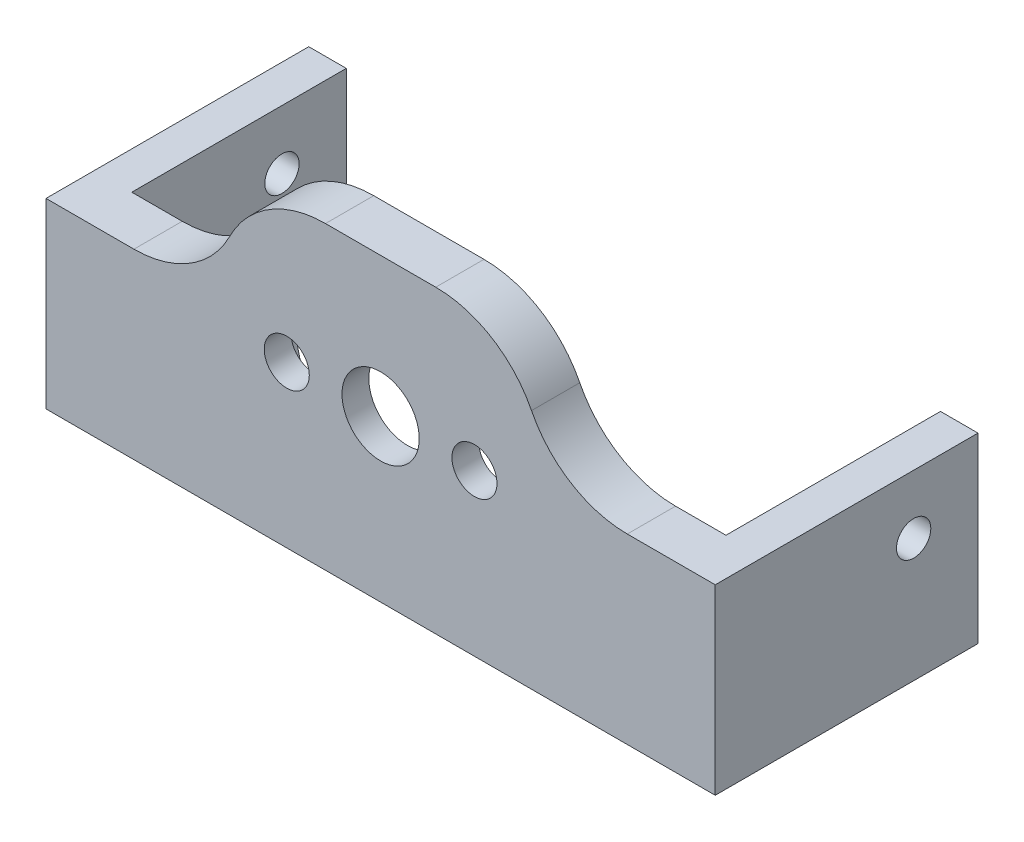
ISO-10303-21;
HEADER;
FILE_DESCRIPTION(('STEP AP214'),'2;1');
FILE_NAME('part.step','',(''),(''),'','','');
FILE_SCHEMA(('AUTOMOTIVE_DESIGN { 1 0 10303 214 1 1 1 1 }'));
ENDSEC;
DATA;
#1=APPLICATION_CONTEXT('core data for automotive mechanical design processes');
#2=APPLICATION_PROTOCOL_DEFINITION('international standard','automotive_design',2000,#1);
#3=PRODUCT_CONTEXT('',#1,'mechanical');
#4=PRODUCT('Part','Part','',(#3));
#5=PRODUCT_RELATED_PRODUCT_CATEGORY('part','',(#4));
#6=PRODUCT_DEFINITION_FORMATION('','',#4);
#7=PRODUCT_DEFINITION_CONTEXT('part definition',#1,'design');
#8=PRODUCT_DEFINITION('design','',#6,#7);
#9=PRODUCT_DEFINITION_SHAPE('','',#8);
#10=(LENGTH_UNIT() NAMED_UNIT(*) SI_UNIT(.MILLI.,.METRE.));
#11=(NAMED_UNIT(*) PLANE_ANGLE_UNIT() SI_UNIT($,.RADIAN.));
#12=(NAMED_UNIT(*) SI_UNIT($,.STERADIAN.) SOLID_ANGLE_UNIT());
#13=UNCERTAINTY_MEASURE_WITH_UNIT(LENGTH_MEASURE(1.E-05),#10,'distance_accuracy_value','');
#14=(GEOMETRIC_REPRESENTATION_CONTEXT(3) GLOBAL_UNCERTAINTY_ASSIGNED_CONTEXT((#13)) GLOBAL_UNIT_ASSIGNED_CONTEXT((#10,
#11,#12)) REPRESENTATION_CONTEXT('',''));
#15=CARTESIAN_POINT('',(0.,0.,0.));
#16=DIRECTION('',(0.,0.,1.));
#17=DIRECTION('',(1.,0.,0.));
#18=AXIS2_PLACEMENT_3D('',#15,#16,#17);
#19=CARTESIAN_POINT('',(0.,0.,0.));
#20=DIRECTION('',(0.,0.,1.));
#21=DIRECTION('',(1.,0.,0.));
#22=AXIS2_PLACEMENT_3D('',#19,#20,#21);
#23=PLANE('',#22);
#24=CARTESIAN_POINT('',(5.87133479212253,0.142231947483589,0.));
#25=DIRECTION('',(0.,0.,-1.));
#26=DIRECTION('',(-1.,0.,0.));
#27=AXIS2_PLACEMENT_3D('',#24,#25,#26);
#28=CIRCLE('',#27,12.55);
#29=CARTESIAN_POINT('',(-6.67866520787747,0.142231947483589,0.));
#30=VERTEX_POINT('',#29);
#31=EDGE_CURVE('E209',#30,#30,#28,.T.);
#32=ORIENTED_EDGE('',*,*,#31,.F.);
#33=EDGE_LOOP('',(#32));
#34=FACE_BOUND('',#33,.T.);
#35=CARTESIAN_POINT('',(-17.1286652078775,12.1422319474836,0.));
#36=DIRECTION('',(0.,0.,1.));
#37=DIRECTION('',(1.,0.,0.));
#38=AXIS2_PLACEMENT_3D('',#35,#36,#37);
#39=CIRCLE('',#38,10.);
#40=CARTESIAN_POINT('',(-17.1286652078775,2.14223194748359,0.));
#41=VERTEX_POINT('',#40);
#42=CARTESIAN_POINT('',(-8.19837965813159,7.64223194748359,0.));
#43=VERTEX_POINT('',#42);
#44=EDGE_CURVE('E259',#41,#43,#39,.T.);
#45=ORIENTED_EDGE('',*,*,#44,.T.);
#46=CARTESIAN_POINT('',(0.731905891614284,3.14223194748359,0.));
#47=DIRECTION('',(0.,0.,1.));
#48=DIRECTION('',(1.,0.,0.));
#49=AXIS2_PLACEMENT_3D('',#46,#47,#48);
#50=CIRCLE('',#49,10.);
#51=CARTESIAN_POINT('',(0.731905891614279,13.1422319474836,0.));
#52=VERTEX_POINT('',#51);
#53=EDGE_CURVE('E272',#43,#52,#50,.F.);
#54=ORIENTED_EDGE('',*,*,#53,.T.);
#55=DIRECTION('',(-1.,0.,0.));
#56=VECTOR('',#55,1.);
#57=CARTESIAN_POINT('',(-7.12866520787747,13.1422319474836,0.));
#58=LINE('',#57,#56);
#59=CARTESIAN_POINT('',(11.0107636926308,13.1422319474836,0.));
#60=VERTEX_POINT('',#59);
#61=EDGE_CURVE('E161',#60,#52,#58,.T.);
#62=ORIENTED_EDGE('',*,*,#61,.F.);
#63=CARTESIAN_POINT('',(11.0107636926308,3.14223194748359,0.));
#64=DIRECTION('',(0.,0.,1.));
#65=DIRECTION('',(1.,0.,0.));
#66=AXIS2_PLACEMENT_3D('',#63,#64,#65);
#67=CIRCLE('',#66,10.);
#68=CARTESIAN_POINT('',(19.9410492423767,7.64223194748359,0.));
#69=VERTEX_POINT('',#68);
#70=EDGE_CURVE('E270',#60,#69,#67,.F.);
#71=ORIENTED_EDGE('',*,*,#70,.T.);
#72=CARTESIAN_POINT('',(28.8713347921225,12.1422319474836,0.));
#73=DIRECTION('',(0.,0.,1.));
#74=DIRECTION('',(1.,0.,0.));
#75=AXIS2_PLACEMENT_3D('',#72,#73,#74);
#76=CIRCLE('',#75,10.);
#77=CARTESIAN_POINT('',(28.8713347921225,2.1422319474836,0.));
#78=VERTEX_POINT('',#77);
#79=EDGE_CURVE('E263',#69,#78,#76,.T.);
#80=ORIENTED_EDGE('',*,*,#79,.T.);
#81=DIRECTION('',(-1.,0.,0.));
#82=VECTOR('',#81,1.);
#83=CARTESIAN_POINT('',(18.8713347921225,2.14223194748359,0.));
#84=LINE('',#83,#82);
#85=CARTESIAN_POINT('',(33.5713347921225,2.1422319474836,0.));
#86=VERTEX_POINT('',#85);
#87=EDGE_CURVE('E227',#86,#78,#84,.T.);
#88=ORIENTED_EDGE('',*,*,#87,.F.);
#89=DIRECTION('',(0.,1.,0.));
#90=VECTOR('',#89,1.);
#91=CARTESIAN_POINT('',(33.5713347921225,2.1422319474836,0.));
#92=LINE('',#91,#90);
#93=CARTESIAN_POINT('',(33.5713347921225,-14.8577680525164,0.));
#94=VERTEX_POINT('',#93);
#95=EDGE_CURVE('E174',#94,#86,#92,.T.);
#96=ORIENTED_EDGE('',*,*,#95,.F.);
#97=DIRECTION('',(1.,0.,0.));
#98=VECTOR('',#97,1.);
#99=CARTESIAN_POINT('',(-25.3286652078775,-14.8577680525164,0.));
#100=LINE('',#99,#98);
#101=CARTESIAN_POINT('',(-21.8286652078775,-14.8577680525164,0.));
#102=VERTEX_POINT('',#101);
#103=EDGE_CURVE('E160',#102,#94,#100,.T.);
#104=ORIENTED_EDGE('',*,*,#103,.F.);
#105=DIRECTION('',(0.,-1.,0.));
#106=VECTOR('',#105,1.);
#107=CARTESIAN_POINT('',(-21.8286652078775,2.1422319474836,0.));
#108=LINE('',#107,#106);
#109=CARTESIAN_POINT('',(-21.8286652078775,2.1422319474836,0.));
#110=VERTEX_POINT('',#109);
#111=EDGE_CURVE('E167',#110,#102,#108,.T.);
#112=ORIENTED_EDGE('',*,*,#111,.F.);
#113=DIRECTION('',(-1.,0.,0.));
#114=VECTOR('',#113,1.);
#115=CARTESIAN_POINT('',(-7.12866520787747,2.14223194748359,0.));
#116=LINE('',#115,#114);
#117=EDGE_CURVE('E148',#41,#110,#116,.T.);
#118=ORIENTED_EDGE('',*,*,#117,.F.);
#119=EDGE_LOOP('',(#45,#54,#62,#71,#80,#88,#96,#104,#112,#118));
#120=FACE_BOUND('',#119,.T.);
#121=ADVANCED_FACE('F43',(#34,#120),#23,.F.);
#122=CARTESIAN_POINT('',(37.0713347921225,2.1422319474836,4.5));
#123=DIRECTION('',(-1.,0.,0.));
#124=DIRECTION('',(0.,0.,1.));
#125=AXIS2_PLACEMENT_3D('',#122,#123,#124);
#126=PLANE('',#125);
#127=CARTESIAN_POINT('',(37.0713347921225,-3.35776805251641,-14.));
#128=DIRECTION('',(1.,0.,0.));
#129=DIRECTION('',(0.,0.,-1.));
#130=AXIS2_PLACEMENT_3D('',#127,#128,#129);
#131=CIRCLE('',#130,1.6);
#132=CARTESIAN_POINT('',(37.0713347921225,-3.35776805251641,-15.6));
#133=VERTEX_POINT('',#132);
#134=EDGE_CURVE('E389',#133,#133,#131,.T.);
#135=ORIENTED_EDGE('',*,*,#134,.F.);
#136=EDGE_LOOP('',(#135));
#137=FACE_BOUND('',#136,.T.);
#138=DIRECTION('',(0.,0.,-1.));
#139=VECTOR('',#138,1.);
#140=CARTESIAN_POINT('',(37.0713347921225,-14.8577680525164,4.5));
#141=LINE('',#140,#139);
#142=CARTESIAN_POINT('',(37.0713347921225,-14.8577680525164,4.5));
#143=VERTEX_POINT('',#142);
#144=CARTESIAN_POINT('',(37.0713347921225,-14.8577680525164,-20.));
#145=VERTEX_POINT('',#144);
#146=EDGE_CURVE('E244',#143,#145,#141,.T.);
#147=ORIENTED_EDGE('',*,*,#146,.T.);
#148=DIRECTION('',(0.,-1.,0.));
#149=VECTOR('',#148,1.);
#150=CARTESIAN_POINT('',(37.0713347921225,2.1422319474836,-20.));
#151=LINE('',#150,#149);
#152=CARTESIAN_POINT('',(37.0713347921225,2.1422319474836,-20.));
#153=VERTEX_POINT('',#152);
#154=EDGE_CURVE('E178',#153,#145,#151,.T.);
#155=ORIENTED_EDGE('',*,*,#154,.F.);
#156=DIRECTION('',(0.,0.,-1.));
#157=VECTOR('',#156,1.);
#158=CARTESIAN_POINT('',(37.0713347921225,2.1422319474836,4.5));
#159=LINE('',#158,#157);
#160=CARTESIAN_POINT('',(37.0713347921225,2.1422319474836,4.5));
#161=VERTEX_POINT('',#160);
#162=EDGE_CURVE('E254',#161,#153,#159,.T.);
#163=ORIENTED_EDGE('',*,*,#162,.F.);
#164=DIRECTION('',(0.,1.,0.));
#165=VECTOR('',#164,1.);
#166=CARTESIAN_POINT('',(37.0713347921225,2.1422319474836,4.5));
#167=LINE('',#166,#165);
#168=EDGE_CURVE('E230',#143,#161,#167,.T.);
#169=ORIENTED_EDGE('',*,*,#168,.F.);
#170=EDGE_LOOP('',(#147,#155,#163,#169));
#171=FACE_BOUND('',#170,.T.);
#172=ADVANCED_FACE('F304',(#137,#171),#126,.F.);
#173=CARTESIAN_POINT('',(18.8713347921225,2.14223194748359,4.5));
#174=DIRECTION('',(0.,-1.,0.));
#175=DIRECTION('',(1.,0.,0.));
#176=AXIS2_PLACEMENT_3D('',#173,#174,#175);
#177=PLANE('',#176);
#178=ORIENTED_EDGE('',*,*,#87,.T.);
#179=DIRECTION('',(0.,0.,-1.));
#180=VECTOR('',#179,1.);
#181=CARTESIAN_POINT('',(28.8713347921225,2.1422319474836,4.5));
#182=LINE('',#181,#180);
#183=CARTESIAN_POINT('',(28.8713347921225,2.1422319474836,4.5));
#184=VERTEX_POINT('',#183);
#185=EDGE_CURVE('E257',#78,#184,#182,.F.);
#186=ORIENTED_EDGE('',*,*,#185,.T.);
#187=DIRECTION('',(-1.,0.,0.));
#188=VECTOR('',#187,1.);
#189=CARTESIAN_POINT('',(18.8713347921225,2.14223194748359,4.5));
#190=LINE('',#189,#188);
#191=EDGE_CURVE('E233',#161,#184,#190,.T.);
#192=ORIENTED_EDGE('',*,*,#191,.F.);
#193=ORIENTED_EDGE('',*,*,#162,.T.);
#194=DIRECTION('',(1.,0.,0.));
#195=VECTOR('',#194,1.);
#196=CARTESIAN_POINT('',(37.0713347921225,2.1422319474836,-20.));
#197=LINE('',#196,#195);
#198=CARTESIAN_POINT('',(33.5713347921225,2.1422319474836,-20.));
#199=VERTEX_POINT('',#198);
#200=EDGE_CURVE('E196',#199,#153,#197,.T.);
#201=ORIENTED_EDGE('',*,*,#200,.F.);
#202=DIRECTION('',(0.,0.,1.));
#203=VECTOR('',#202,1.);
#204=CARTESIAN_POINT('',(33.5713347921225,2.1422319474836,-20.));
#205=LINE('',#204,#203);
#206=EDGE_CURVE('E198',#199,#86,#205,.T.);
#207=ORIENTED_EDGE('',*,*,#206,.T.);
#208=EDGE_LOOP('',(#178,#186,#192,#193,#201,#207));
#209=FACE_BOUND('',#208,.T.);
#210=ADVANCED_FACE('F297',(#209),#177,.F.);
#211=CARTESIAN_POINT('',(-7.12866520787747,13.1422319474836,4.5));
#212=DIRECTION('',(0.,-1.,0.));
#213=DIRECTION('',(1.,0.,0.));
#214=AXIS2_PLACEMENT_3D('',#211,#212,#213);
#215=PLANE('',#214);
#216=ORIENTED_EDGE('',*,*,#61,.T.);
#217=DIRECTION('',(0.,0.,1.));
#218=VECTOR('',#217,1.);
#219=CARTESIAN_POINT('',(0.731905891614282,13.1422319474836,4.5));
#220=LINE('',#219,#218);
#221=CARTESIAN_POINT('',(0.731905891614279,13.1422319474836,4.5));
#222=VERTEX_POINT('',#221);
#223=EDGE_CURVE('E65',#52,#222,#220,.T.);
#224=ORIENTED_EDGE('',*,*,#223,.T.);
#225=DIRECTION('',(-1.,0.,0.));
#226=VECTOR('',#225,1.);
#227=CARTESIAN_POINT('',(-7.12866520787747,13.1422319474836,4.5));
#228=LINE('',#227,#226);
#229=CARTESIAN_POINT('',(11.0107636926308,13.1422319474836,4.5));
#230=VERTEX_POINT('',#229);
#231=EDGE_CURVE('E236',#230,#222,#228,.T.);
#232=ORIENTED_EDGE('',*,*,#231,.F.);
#233=DIRECTION('',(0.,0.,1.));
#234=VECTOR('',#233,1.);
#235=CARTESIAN_POINT('',(11.0107636926308,13.1422319474836,4.5));
#236=LINE('',#235,#234);
#237=EDGE_CURVE('E274',#230,#60,#236,.F.);
#238=ORIENTED_EDGE('',*,*,#237,.T.);
#239=EDGE_LOOP('',(#216,#224,#232,#238));
#240=FACE_BOUND('',#239,.T.);
#241=ADVANCED_FACE('F290',(#240),#215,.F.);
#242=CARTESIAN_POINT('',(-7.12866520787747,2.14223194748359,4.5));
#243=DIRECTION('',(0.,-1.,0.));
#244=DIRECTION('',(1.,0.,0.));
#245=AXIS2_PLACEMENT_3D('',#242,#243,#244);
#246=PLANE('',#245);
#247=DIRECTION('',(-1.,0.,0.));
#248=VECTOR('',#247,1.);
#249=CARTESIAN_POINT('',(-7.12866520787747,2.14223194748359,4.5));
#250=LINE('',#249,#248);
#251=CARTESIAN_POINT('',(-17.1286652078775,2.14223194748359,4.5));
#252=VERTEX_POINT('',#251);
#253=CARTESIAN_POINT('',(-25.3286652078775,2.14223194748359,4.5));
#254=VERTEX_POINT('',#253);
#255=EDGE_CURVE('E238',#252,#254,#250,.T.);
#256=ORIENTED_EDGE('',*,*,#255,.F.);
#257=DIRECTION('',(0.,0.,-1.));
#258=VECTOR('',#257,1.);
#259=CARTESIAN_POINT('',(-17.1286652078775,2.14223194748359,0.));
#260=LINE('',#259,#258);
#261=EDGE_CURVE('E156',#252,#41,#260,.T.);
#262=ORIENTED_EDGE('',*,*,#261,.T.);
#263=ORIENTED_EDGE('',*,*,#117,.T.);
#264=DIRECTION('',(0.,0.,1.));
#265=VECTOR('',#264,1.);
#266=CARTESIAN_POINT('',(-21.8286652078775,2.1422319474836,-20.));
#267=LINE('',#266,#265);
#268=CARTESIAN_POINT('',(-21.8286652078775,2.1422319474836,-20.));
#269=VERTEX_POINT('',#268);
#270=EDGE_CURVE('E153',#269,#110,#267,.T.);
#271=ORIENTED_EDGE('',*,*,#270,.F.);
#272=DIRECTION('',(1.,0.,0.));
#273=VECTOR('',#272,1.);
#274=CARTESIAN_POINT('',(-25.3286652078775,2.1422319474836,-20.));
#275=LINE('',#274,#273);
#276=CARTESIAN_POINT('',(-25.3286652078775,2.1422319474836,-20.));
#277=VERTEX_POINT('',#276);
#278=EDGE_CURVE('E181',#277,#269,#275,.T.);
#279=ORIENTED_EDGE('',*,*,#278,.F.);
#280=DIRECTION('',(0.,0.,-1.));
#281=VECTOR('',#280,1.);
#282=CARTESIAN_POINT('',(-25.3286652078775,2.14223194748359,4.5));
#283=LINE('',#282,#281);
#284=EDGE_CURVE('E252',#254,#277,#283,.T.);
#285=ORIENTED_EDGE('',*,*,#284,.F.);
#286=EDGE_LOOP('',(#256,#262,#263,#271,#279,#285));
#287=FACE_BOUND('',#286,.T.);
#288=ADVANCED_FACE('F151',(#287),#246,.F.);
#289=CARTESIAN_POINT('',(-25.3286652078775,2.14223194748359,4.5));
#290=DIRECTION('',(1.,0.,0.));
#291=DIRECTION('',(0.,1.,0.));
#292=AXIS2_PLACEMENT_3D('',#289,#290,#291);
#293=PLANE('',#292);
#294=CARTESIAN_POINT('',(-25.3286652078775,-3.35776805251641,-14.));
#295=DIRECTION('',(1.,0.,0.));
#296=DIRECTION('',(0.,0.,-1.));
#297=AXIS2_PLACEMENT_3D('',#294,#295,#296);
#298=CIRCLE('',#297,1.6);
#299=CARTESIAN_POINT('',(-25.3286652078775,-3.35776805251641,-15.6));
#300=VERTEX_POINT('',#299);
#301=EDGE_CURVE('E394',#300,#300,#298,.T.);
#302=ORIENTED_EDGE('',*,*,#301,.T.);
#303=EDGE_LOOP('',(#302));
#304=FACE_BOUND('',#303,.T.);
#305=ORIENTED_EDGE('',*,*,#284,.T.);
#306=DIRECTION('',(0.,1.,0.));
#307=VECTOR('',#306,1.);
#308=CARTESIAN_POINT('',(-25.3286652078775,2.1422319474836,-20.));
#309=LINE('',#308,#307);
#310=CARTESIAN_POINT('',(-25.3286652078775,-14.8577680525164,-20.));
#311=VERTEX_POINT('',#310);
#312=EDGE_CURVE('E175',#311,#277,#309,.T.);
#313=ORIENTED_EDGE('',*,*,#312,.F.);
#314=DIRECTION('',(0.,0.,-1.));
#315=VECTOR('',#314,1.);
#316=CARTESIAN_POINT('',(-25.3286652078775,-14.8577680525164,4.5));
#317=LINE('',#316,#315);
#318=CARTESIAN_POINT('',(-25.3286652078775,-14.8577680525164,4.5));
#319=VERTEX_POINT('',#318);
#320=EDGE_CURVE('E250',#319,#311,#317,.T.);
#321=ORIENTED_EDGE('',*,*,#320,.F.);
#322=DIRECTION('',(0.,-1.,0.));
#323=VECTOR('',#322,1.);
#324=CARTESIAN_POINT('',(-25.3286652078775,2.14223194748359,4.5));
#325=LINE('',#324,#323);
#326=EDGE_CURVE('E240',#254,#319,#325,.T.);
#327=ORIENTED_EDGE('',*,*,#326,.F.);
#328=EDGE_LOOP('',(#305,#313,#321,#327));
#329=FACE_BOUND('',#328,.T.);
#330=ADVANCED_FACE('F322',(#304,#329),#293,.F.);
#331=CARTESIAN_POINT('',(-25.3286652078775,-14.8577680525164,4.5));
#332=DIRECTION('',(0.,1.,0.));
#333=DIRECTION('',(-1.,0.,0.));
#334=AXIS2_PLACEMENT_3D('',#331,#332,#333);
#335=PLANE('',#334);
#336=ORIENTED_EDGE('',*,*,#320,.T.);
#337=DIRECTION('',(-1.,0.,0.));
#338=VECTOR('',#337,1.);
#339=CARTESIAN_POINT('',(-25.3286652078775,-14.8577680525164,-20.));
#340=LINE('',#339,#338);
#341=CARTESIAN_POINT('',(-21.8286652078775,-14.8577680525164,-20.));
#342=VERTEX_POINT('',#341);
#343=EDGE_CURVE('E185',#342,#311,#340,.T.);
#344=ORIENTED_EDGE('',*,*,#343,.F.);
#345=DIRECTION('',(0.,0.,1.));
#346=VECTOR('',#345,1.);
#347=CARTESIAN_POINT('',(-21.8286652078775,-14.8577680525164,-20.));
#348=LINE('',#347,#346);
#349=EDGE_CURVE('E170',#342,#102,#348,.T.);
#350=ORIENTED_EDGE('',*,*,#349,.T.);
#351=ORIENTED_EDGE('',*,*,#103,.T.);
#352=DIRECTION('',(0.,0.,1.));
#353=VECTOR('',#352,1.);
#354=CARTESIAN_POINT('',(33.5713347921225,-14.8577680525164,-20.));
#355=LINE('',#354,#353);
#356=CARTESIAN_POINT('',(33.5713347921225,-14.8577680525164,-20.));
#357=VERTEX_POINT('',#356);
#358=EDGE_CURVE('E202',#357,#94,#355,.T.);
#359=ORIENTED_EDGE('',*,*,#358,.F.);
#360=DIRECTION('',(-1.,0.,0.));
#361=VECTOR('',#360,1.);
#362=CARTESIAN_POINT('',(37.0713347921225,-14.8577680525164,-20.));
#363=LINE('',#362,#361);
#364=EDGE_CURVE('E192',#145,#357,#363,.T.);
#365=ORIENTED_EDGE('',*,*,#364,.F.);
#366=ORIENTED_EDGE('',*,*,#146,.F.);
#367=DIRECTION('',(1.,0.,0.));
#368=VECTOR('',#367,1.);
#369=CARTESIAN_POINT('',(-25.3286652078775,-14.8577680525164,4.5));
#370=LINE('',#369,#368);
#371=EDGE_CURVE('E242',#319,#143,#370,.T.);
#372=ORIENTED_EDGE('',*,*,#371,.F.);
#373=EDGE_LOOP('',(#336,#344,#350,#351,#359,#365,#366,#372));
#374=FACE_BOUND('',#373,.T.);
#375=ADVANCED_FACE('F315',(#374),#335,.F.);
#376=CARTESIAN_POINT('',(0.,0.,4.5));
#377=DIRECTION('',(0.,0.,1.));
#378=DIRECTION('',(1.,0.,0.));
#379=AXIS2_PLACEMENT_3D('',#376,#377,#378);
#380=PLANE('',#379);
#381=CARTESIAN_POINT('',(14.6213347921225,0.142231947483589,4.5));
#382=DIRECTION('',(0.,0.,1.));
#383=DIRECTION('',(1.,0.,0.));
#384=AXIS2_PLACEMENT_3D('',#381,#382,#383);
#385=CIRCLE('',#384,2.1);
#386=CARTESIAN_POINT('',(16.7213347921225,0.142231947483589,4.5));
#387=VERTEX_POINT('',#386);
#388=EDGE_CURVE('E210',#387,#387,#385,.F.);
#389=ORIENTED_EDGE('',*,*,#388,.T.);
#390=EDGE_LOOP('',(#389));
#391=FACE_BOUND('',#390,.T.);
#392=CARTESIAN_POINT('',(-2.87866520787747,0.142231947483592,4.5));
#393=DIRECTION('',(0.,0.,1.));
#394=DIRECTION('',(1.,0.,0.));
#395=AXIS2_PLACEMENT_3D('',#392,#393,#394);
#396=CIRCLE('',#395,2.1);
#397=CARTESIAN_POINT('',(-0.778665207877467,0.142231947483592,4.5));
#398=VERTEX_POINT('',#397);
#399=EDGE_CURVE('E213',#398,#398,#396,.F.);
#400=ORIENTED_EDGE('',*,*,#399,.T.);
#401=EDGE_LOOP('',(#400));
#402=FACE_BOUND('',#401,.T.);
#403=CARTESIAN_POINT('',(5.87133479212253,0.142231947483589,4.5));
#404=DIRECTION('',(0.,0.,1.));
#405=DIRECTION('',(1.,0.,0.));
#406=AXIS2_PLACEMENT_3D('',#403,#404,#405);
#407=CIRCLE('',#406,3.6);
#408=CARTESIAN_POINT('',(9.47133479212253,0.142231947483589,4.5));
#409=VERTEX_POINT('',#408);
#410=EDGE_CURVE('E219',#409,#409,#407,.F.);
#411=ORIENTED_EDGE('',*,*,#410,.T.);
#412=EDGE_LOOP('',(#411));
#413=FACE_BOUND('',#412,.T.);
#414=ORIENTED_EDGE('',*,*,#231,.T.);
#415=CARTESIAN_POINT('',(0.731905891614284,3.14223194748359,4.5));
#416=DIRECTION('',(0.,0.,1.));
#417=DIRECTION('',(1.,0.,0.));
#418=AXIS2_PLACEMENT_3D('',#415,#416,#417);
#419=CIRCLE('',#418,10.);
#420=CARTESIAN_POINT('',(-8.19837965813159,7.64223194748359,4.5));
#421=VERTEX_POINT('',#420);
#422=EDGE_CURVE('E52',#222,#421,#419,.T.);
#423=ORIENTED_EDGE('',*,*,#422,.T.);
#424=CARTESIAN_POINT('',(-17.1286652078775,12.1422319474836,4.5));
#425=DIRECTION('',(0.,0.,1.));
#426=DIRECTION('',(1.,0.,0.));
#427=AXIS2_PLACEMENT_3D('',#424,#425,#426);
#428=CIRCLE('',#427,10.);
#429=EDGE_CURVE('E261',#421,#252,#428,.F.);
#430=ORIENTED_EDGE('',*,*,#429,.T.);
#431=ORIENTED_EDGE('',*,*,#255,.T.);
#432=ORIENTED_EDGE('',*,*,#326,.T.);
#433=ORIENTED_EDGE('',*,*,#371,.T.);
#434=ORIENTED_EDGE('',*,*,#168,.T.);
#435=ORIENTED_EDGE('',*,*,#191,.T.);
#436=CARTESIAN_POINT('',(28.8713347921225,12.1422319474836,4.5));
#437=DIRECTION('',(0.,0.,1.));
#438=DIRECTION('',(1.,0.,0.));
#439=AXIS2_PLACEMENT_3D('',#436,#437,#438);
#440=CIRCLE('',#439,10.);
#441=CARTESIAN_POINT('',(19.9410492423767,7.64223194748359,4.5));
#442=VERTEX_POINT('',#441);
#443=EDGE_CURVE('E265',#184,#442,#440,.F.);
#444=ORIENTED_EDGE('',*,*,#443,.T.);
#445=CARTESIAN_POINT('',(11.0107636926308,3.14223194748359,4.5));
#446=DIRECTION('',(0.,0.,1.));
#447=DIRECTION('',(1.,0.,0.));
#448=AXIS2_PLACEMENT_3D('',#445,#446,#447);
#449=CIRCLE('',#448,10.);
#450=EDGE_CURVE('E278',#442,#230,#449,.T.);
#451=ORIENTED_EDGE('',*,*,#450,.T.);
#452=EDGE_LOOP('',(#414,#423,#430,#431,#432,#433,#434,#435,#444,#451));
#453=FACE_BOUND('',#452,.T.);
#454=ADVANCED_FACE('F283',(#391,#402,#413,#453),#380,.T.);
#455=CARTESIAN_POINT('',(5.87133479212253,0.142231947483589,2.));
#456=DIRECTION('',(0.,0.,-1.));
#457=DIRECTION('',(-1.,0.,0.));
#458=AXIS2_PLACEMENT_3D('',#455,#456,#457);
#459=CYLINDRICAL_SURFACE('',#458,12.55);
#460=CARTESIAN_POINT('',(5.87133479212253,0.142231947483589,2.));
#461=DIRECTION('',(0.,0.,-1.));
#462=DIRECTION('',(-1.,0.,0.));
#463=AXIS2_PLACEMENT_3D('',#460,#461,#462);
#464=CIRCLE('',#463,12.55);
#465=CARTESIAN_POINT('',(-6.67866520787747,0.142231947483589,2.));
#466=VERTEX_POINT('',#465);
#467=EDGE_CURVE('E224',#466,#466,#464,.T.);
#468=ORIENTED_EDGE('',*,*,#467,.F.);
#469=EDGE_LOOP('',(#468));
#470=FACE_BOUND('',#469,.T.);
#471=ORIENTED_EDGE('',*,*,#31,.T.);
#472=EDGE_LOOP('',(#471));
#473=FACE_BOUND('',#472,.T.);
#474=ADVANCED_FACE('F347',(#470,#473),#459,.F.);
#475=CARTESIAN_POINT('',(5.87133479212253,0.142231947483589,2.));
#476=DIRECTION('',(0.,0.,-1.));
#477=DIRECTION('',(-1.,0.,0.));
#478=AXIS2_PLACEMENT_3D('',#475,#476,#477);
#479=PLANE('',#478);
#480=CARTESIAN_POINT('',(5.87133479212253,0.142231947483589,2.));
#481=DIRECTION('',(0.,0.,-1.));
#482=DIRECTION('',(-1.,0.,0.));
#483=AXIS2_PLACEMENT_3D('',#480,#481,#482);
#484=CIRCLE('',#483,3.6);
#485=CARTESIAN_POINT('',(2.27133479212253,0.142231947483589,2.));
#486=VERTEX_POINT('',#485);
#487=EDGE_CURVE('E205',#486,#486,#484,.T.);
#488=ORIENTED_EDGE('',*,*,#487,.F.);
#489=EDGE_LOOP('',(#488));
#490=FACE_BOUND('',#489,.T.);
#491=CARTESIAN_POINT('',(14.6213347921225,0.142231947483589,2.));
#492=DIRECTION('',(0.,0.,-1.));
#493=DIRECTION('',(-1.,0.,0.));
#494=AXIS2_PLACEMENT_3D('',#491,#492,#493);
#495=CIRCLE('',#494,2.1);
#496=CARTESIAN_POINT('',(12.5213347921225,0.142231947483589,2.));
#497=VERTEX_POINT('',#496);
#498=EDGE_CURVE('E206',#497,#497,#495,.T.);
#499=ORIENTED_EDGE('',*,*,#498,.F.);
#500=EDGE_LOOP('',(#499));
#501=FACE_BOUND('',#500,.T.);
#502=CARTESIAN_POINT('',(-2.87866520787747,0.142231947483592,2.));
#503=DIRECTION('',(0.,0.,-1.));
#504=DIRECTION('',(1.,0.,0.));
#505=AXIS2_PLACEMENT_3D('',#502,#503,#504);
#506=CIRCLE('',#505,2.1);
#507=CARTESIAN_POINT('',(-0.778665207877467,0.142231947483592,2.));
#508=VERTEX_POINT('',#507);
#509=EDGE_CURVE('E216',#508,#508,#506,.T.);
#510=ORIENTED_EDGE('',*,*,#509,.F.);
#511=EDGE_LOOP('',(#510));
#512=FACE_BOUND('',#511,.T.);
#513=ORIENTED_EDGE('',*,*,#467,.T.);
#514=EDGE_LOOP('',(#513));
#515=FACE_BOUND('',#514,.T.);
#516=ADVANCED_FACE('F351',(#490,#501,#512,#515),#479,.T.);
#517=CARTESIAN_POINT('',(-2.87866520787747,0.142231947483592,4.501));
#518=DIRECTION('',(0.,0.,-1.));
#519=DIRECTION('',(-1.,0.,0.));
#520=AXIS2_PLACEMENT_3D('',#517,#518,#519);
#521=CYLINDRICAL_SURFACE('',#520,2.1);
#522=ORIENTED_EDGE('',*,*,#399,.F.);
#523=EDGE_LOOP('',(#522));
#524=FACE_BOUND('',#523,.T.);
#525=ORIENTED_EDGE('',*,*,#509,.T.);
#526=EDGE_LOOP('',(#525));
#527=FACE_BOUND('',#526,.T.);
#528=ADVANCED_FACE('F355',(#524,#527),#521,.F.);
#529=CARTESIAN_POINT('',(14.6213347921225,0.142231947483589,4.501));
#530=DIRECTION('',(0.,0.,-1.));
#531=DIRECTION('',(-1.,0.,0.));
#532=AXIS2_PLACEMENT_3D('',#529,#530,#531);
#533=CYLINDRICAL_SURFACE('',#532,2.1);
#534=ORIENTED_EDGE('',*,*,#388,.F.);
#535=EDGE_LOOP('',(#534));
#536=FACE_BOUND('',#535,.T.);
#537=ORIENTED_EDGE('',*,*,#498,.T.);
#538=EDGE_LOOP('',(#537));
#539=FACE_BOUND('',#538,.T.);
#540=ADVANCED_FACE('F360',(#536,#539),#533,.F.);
#541=CARTESIAN_POINT('',(5.87133479212253,0.142231947483589,4.501));
#542=DIRECTION('',(0.,0.,-1.));
#543=DIRECTION('',(-1.,0.,0.));
#544=AXIS2_PLACEMENT_3D('',#541,#542,#543);
#545=CYLINDRICAL_SURFACE('',#544,3.6);
#546=ORIENTED_EDGE('',*,*,#410,.F.);
#547=EDGE_LOOP('',(#546));
#548=FACE_BOUND('',#547,.T.);
#549=ORIENTED_EDGE('',*,*,#487,.T.);
#550=EDGE_LOOP('',(#549));
#551=FACE_BOUND('',#550,.T.);
#552=ADVANCED_FACE('F357',(#548,#551),#545,.F.);
#553=CARTESIAN_POINT('',(33.5713347921225,2.1422319474836,-20.));
#554=DIRECTION('',(1.,0.,0.));
#555=DIRECTION('',(0.,0.,-1.));
#556=AXIS2_PLACEMENT_3D('',#553,#554,#555);
#557=PLANE('',#556);
#558=CARTESIAN_POINT('',(33.5713347921225,-3.35776805251641,-14.));
#559=DIRECTION('',(1.,0.,0.));
#560=DIRECTION('',(0.,0.,-1.));
#561=AXIS2_PLACEMENT_3D('',#558,#559,#560);
#562=CIRCLE('',#561,1.6);
#563=CARTESIAN_POINT('',(33.5713347921225,-3.35776805251641,-15.6));
#564=VERTEX_POINT('',#563);
#565=EDGE_CURVE('E171',#564,#564,#562,.T.);
#566=ORIENTED_EDGE('',*,*,#565,.T.);
#567=EDGE_LOOP('',(#566));
#568=FACE_BOUND('',#567,.T.);
#569=ORIENTED_EDGE('',*,*,#95,.T.);
#570=ORIENTED_EDGE('',*,*,#206,.F.);
#571=DIRECTION('',(0.,1.,0.));
#572=VECTOR('',#571,1.);
#573=CARTESIAN_POINT('',(33.5713347921225,2.1422319474836,-20.));
#574=LINE('',#573,#572);
#575=EDGE_CURVE('E194',#357,#199,#574,.T.);
#576=ORIENTED_EDGE('',*,*,#575,.F.);
#577=ORIENTED_EDGE('',*,*,#358,.T.);
#578=EDGE_LOOP('',(#569,#570,#576,#577));
#579=FACE_BOUND('',#578,.T.);
#580=ADVANCED_FACE('F313',(#568,#579),#557,.F.);
#581=CARTESIAN_POINT('',(0.,0.,-20.));
#582=DIRECTION('',(0.,0.,-1.));
#583=DIRECTION('',(-1.,0.,0.));
#584=AXIS2_PLACEMENT_3D('',#581,#582,#583);
#585=PLANE('',#584);
#586=ORIENTED_EDGE('',*,*,#154,.T.);
#587=ORIENTED_EDGE('',*,*,#364,.T.);
#588=ORIENTED_EDGE('',*,*,#575,.T.);
#589=ORIENTED_EDGE('',*,*,#200,.T.);
#590=EDGE_LOOP('',(#586,#587,#588,#589));
#591=FACE_BOUND('',#590,.T.);
#592=ADVANCED_FACE('F307',(#591),#585,.T.);
#593=CARTESIAN_POINT('',(-21.8286652078775,2.1422319474836,-20.));
#594=DIRECTION('',(-1.,0.,0.));
#595=DIRECTION('',(0.,0.,1.));
#596=AXIS2_PLACEMENT_3D('',#593,#594,#595);
#597=PLANE('',#596);
#598=CARTESIAN_POINT('',(-21.8286652078775,-3.35776805251641,-14.));
#599=DIRECTION('',(-1.,0.,0.));
#600=DIRECTION('',(0.,0.,1.));
#601=AXIS2_PLACEMENT_3D('',#598,#599,#600);
#602=CIRCLE('',#601,1.6);
#603=CARTESIAN_POINT('',(-21.8286652078775,-3.35776805251641,-12.4));
#604=VERTEX_POINT('',#603);
#605=EDGE_CURVE('E47',#604,#604,#602,.T.);
#606=ORIENTED_EDGE('',*,*,#605,.T.);
#607=EDGE_LOOP('',(#606));
#608=FACE_BOUND('',#607,.T.);
#609=ORIENTED_EDGE('',*,*,#111,.T.);
#610=ORIENTED_EDGE('',*,*,#349,.F.);
#611=DIRECTION('',(0.,-1.,0.));
#612=VECTOR('',#611,1.);
#613=CARTESIAN_POINT('',(-21.8286652078775,2.1422319474836,-20.));
#614=LINE('',#613,#612);
#615=EDGE_CURVE('E169',#269,#342,#614,.T.);
#616=ORIENTED_EDGE('',*,*,#615,.F.);
#617=ORIENTED_EDGE('',*,*,#270,.T.);
#618=EDGE_LOOP('',(#609,#610,#616,#617));
#619=FACE_BOUND('',#618,.T.);
#620=ADVANCED_FACE('F165',(#608,#619),#597,.F.);
#621=CARTESIAN_POINT('',(0.,0.,-20.));
#622=DIRECTION('',(0.,0.,1.));
#623=DIRECTION('',(1.,0.,0.));
#624=AXIS2_PLACEMENT_3D('',#621,#622,#623);
#625=PLANE('',#624);
#626=ORIENTED_EDGE('',*,*,#312,.T.);
#627=ORIENTED_EDGE('',*,*,#278,.T.);
#628=ORIENTED_EDGE('',*,*,#615,.T.);
#629=ORIENTED_EDGE('',*,*,#343,.T.);
#630=EDGE_LOOP('',(#626,#627,#628,#629));
#631=FACE_BOUND('',#630,.T.);
#632=ADVANCED_FACE('F320',(#631),#625,.F.);
#633=CARTESIAN_POINT('',(-17.1286652078775,12.1422319474836,4.5));
#634=DIRECTION('',(0.,0.,1.));
#635=DIRECTION('',(1.,0.,0.));
#636=AXIS2_PLACEMENT_3D('',#633,#634,#635);
#637=CYLINDRICAL_SURFACE('',#636,10.);
#638=ORIENTED_EDGE('',*,*,#429,.F.);
#639=DIRECTION('',(0.,0.,1.));
#640=VECTOR('',#639,1.);
#641=CARTESIAN_POINT('',(-8.19837965813159,7.64223194748359,4.5));
#642=LINE('',#641,#640);
#643=EDGE_CURVE('E267',#421,#43,#642,.F.);
#644=ORIENTED_EDGE('',*,*,#643,.T.);
#645=ORIENTED_EDGE('',*,*,#44,.F.);
#646=ORIENTED_EDGE('',*,*,#261,.F.);
#647=EDGE_LOOP('',(#638,#644,#645,#646));
#648=FACE_BOUND('',#647,.T.);
#649=ADVANCED_FACE('F287',(#648),#637,.F.);
#650=CARTESIAN_POINT('',(28.8713347921225,12.1422319474836,4.5));
#651=DIRECTION('',(0.,0.,1.));
#652=DIRECTION('',(1.,0.,0.));
#653=AXIS2_PLACEMENT_3D('',#650,#651,#652);
#654=CYLINDRICAL_SURFACE('',#653,10.);
#655=ORIENTED_EDGE('',*,*,#79,.F.);
#656=DIRECTION('',(0.,0.,1.));
#657=VECTOR('',#656,1.);
#658=CARTESIAN_POINT('',(19.9410492423767,7.64223194748359,4.5));
#659=LINE('',#658,#657);
#660=EDGE_CURVE('E11',#69,#442,#659,.T.);
#661=ORIENTED_EDGE('',*,*,#660,.T.);
#662=ORIENTED_EDGE('',*,*,#443,.F.);
#663=ORIENTED_EDGE('',*,*,#185,.F.);
#664=EDGE_LOOP('',(#655,#661,#662,#663));
#665=FACE_BOUND('',#664,.T.);
#666=ADVANCED_FACE('F295',(#665),#654,.F.);
#667=CARTESIAN_POINT('',(0.731905891614284,3.14223194748359,4.5));
#668=DIRECTION('',(0.,0.,1.));
#669=DIRECTION('',(1.,0.,0.));
#670=AXIS2_PLACEMENT_3D('',#667,#668,#669);
#671=CYLINDRICAL_SURFACE('',#670,10.);
#672=ORIENTED_EDGE('',*,*,#422,.F.);
#673=ORIENTED_EDGE('',*,*,#223,.F.);
#674=ORIENTED_EDGE('',*,*,#53,.F.);
#675=ORIENTED_EDGE('',*,*,#643,.F.);
#676=EDGE_LOOP('',(#672,#673,#674,#675));
#677=FACE_BOUND('',#676,.T.);
#678=ADVANCED_FACE('F288',(#677),#671,.T.);
#679=CARTESIAN_POINT('',(11.0107636926308,3.14223194748359,4.5));
#680=DIRECTION('',(0.,0.,1.));
#681=DIRECTION('',(1.,0.,0.));
#682=AXIS2_PLACEMENT_3D('',#679,#680,#681);
#683=CYLINDRICAL_SURFACE('',#682,10.);
#684=ORIENTED_EDGE('',*,*,#450,.F.);
#685=ORIENTED_EDGE('',*,*,#660,.F.);
#686=ORIENTED_EDGE('',*,*,#70,.F.);
#687=ORIENTED_EDGE('',*,*,#237,.F.);
#688=EDGE_LOOP('',(#684,#685,#686,#687));
#689=FACE_BOUND('',#688,.T.);
#690=ADVANCED_FACE('F45',(#689),#683,.T.);
#691=CARTESIAN_POINT('',(-25.3286652078775,-3.35776805251641,-14.));
#692=DIRECTION('',(1.,0.,0.));
#693=DIRECTION('',(0.,0.,-1.));
#694=AXIS2_PLACEMENT_3D('',#691,#692,#693);
#695=CYLINDRICAL_SURFACE('',#694,1.6);
#696=ORIENTED_EDGE('',*,*,#301,.F.);
#697=EDGE_LOOP('',(#696));
#698=FACE_BOUND('',#697,.T.);
#699=ORIENTED_EDGE('',*,*,#605,.F.);
#700=EDGE_LOOP('',(#699));
#701=FACE_BOUND('',#700,.T.);
#702=ADVANCED_FACE('F380',(#698,#701),#695,.F.);
#703=ORIENTED_EDGE('',*,*,#134,.T.);
#704=EDGE_LOOP('',(#703));
#705=FACE_BOUND('',#704,.T.);
#706=ORIENTED_EDGE('',*,*,#565,.F.);
#707=EDGE_LOOP('',(#706));
#708=FACE_BOUND('',#707,.T.);
#709=ADVANCED_FACE('F378',(#705,#708),#695,.F.);
#710=CLOSED_SHELL('',(#121,#172,#210,#241,#288,#330,#375,#454,#474,#516,#528,#540,#552,#580,
#592,#620,#632,#649,#666,#678,#690,#702,#709));
#711=MANIFOLD_SOLID_BREP('B2',#710);
#712=ADVANCED_BREP_SHAPE_REPRESENTATION('',(#18,#711),#14);
#713=SHAPE_DEFINITION_REPRESENTATION(#9,#712);
ENDSEC;
END-ISO-10303-21;
